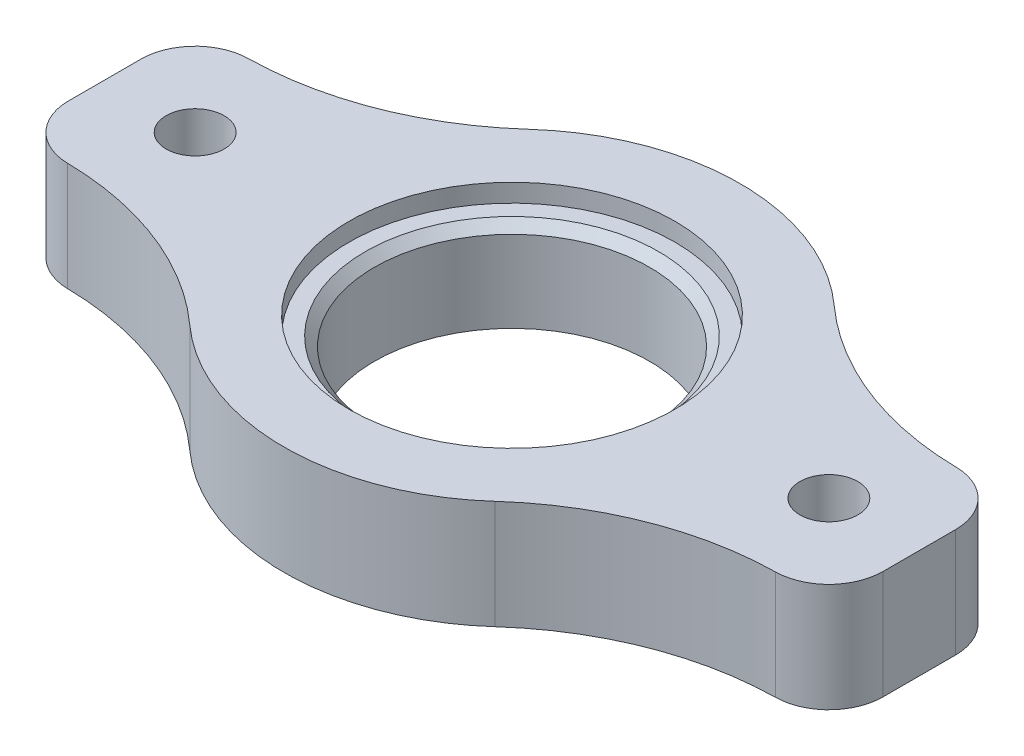
ISO-10303-21;
HEADER;
FILE_DESCRIPTION(('STEP AP214'),'2;1');
FILE_NAME('part.step','',(''),(''),'','','');
FILE_SCHEMA(('AUTOMOTIVE_DESIGN { 1 0 10303 214 1 1 1 1 }'));
ENDSEC;
DATA;
#1=APPLICATION_CONTEXT('core data for automotive mechanical design processes');
#2=APPLICATION_PROTOCOL_DEFINITION('international standard','automotive_design',2000,#1);
#3=PRODUCT_CONTEXT('',#1,'mechanical');
#4=PRODUCT('Part','Part','',(#3));
#5=PRODUCT_RELATED_PRODUCT_CATEGORY('part','',(#4));
#6=PRODUCT_DEFINITION_FORMATION('','',#4);
#7=PRODUCT_DEFINITION_CONTEXT('part definition',#1,'design');
#8=PRODUCT_DEFINITION('design','',#6,#7);
#9=PRODUCT_DEFINITION_SHAPE('','',#8);
#10=(LENGTH_UNIT() NAMED_UNIT(*) SI_UNIT(.MILLI.,.METRE.));
#11=(NAMED_UNIT(*) PLANE_ANGLE_UNIT() SI_UNIT($,.RADIAN.));
#12=(NAMED_UNIT(*) SI_UNIT($,.STERADIAN.) SOLID_ANGLE_UNIT());
#13=UNCERTAINTY_MEASURE_WITH_UNIT(LENGTH_MEASURE(1.E-05),#10,'distance_accuracy_value','');
#14=(GEOMETRIC_REPRESENTATION_CONTEXT(3) GLOBAL_UNCERTAINTY_ASSIGNED_CONTEXT((#13)) GLOBAL_UNIT_ASSIGNED_CONTEXT((#10,
#11,#12)) REPRESENTATION_CONTEXT('',''));
#15=CARTESIAN_POINT('',(0.,0.,0.));
#16=DIRECTION('',(0.,0.,1.));
#17=DIRECTION('',(1.,0.,0.));
#18=AXIS2_PLACEMENT_3D('',#15,#16,#17);
#19=CARTESIAN_POINT('',(0.,6.,0.));
#20=DIRECTION('',(0.,-1.,0.));
#21=DIRECTION('',(0.,0.,-1.));
#22=AXIS2_PLACEMENT_3D('',#19,#20,#21);
#23=CYLINDRICAL_SURFACE('',#22,7.6);
#24=CARTESIAN_POINT('',(0.,4.50000000000001,0.));
#25=DIRECTION('',(0.,1.,0.));
#26=DIRECTION('',(0.,0.,1.));
#27=AXIS2_PLACEMENT_3D('',#24,#25,#26);
#28=CIRCLE('',#27,7.6);
#29=CARTESIAN_POINT('',(0.,4.50000000000001,7.6));
#30=VERTEX_POINT('',#29);
#31=EDGE_CURVE('E51',#30,#30,#28,.T.);
#32=ORIENTED_EDGE('',*,*,#31,.T.);
#33=EDGE_LOOP('',(#32));
#34=FACE_BOUND('',#33,.T.);
#35=CARTESIAN_POINT('',(0.,0.,0.));
#36=DIRECTION('',(0.,1.,0.));
#37=DIRECTION('',(0.,0.,1.));
#38=AXIS2_PLACEMENT_3D('',#35,#36,#37);
#39=CIRCLE('',#38,7.6);
#40=CARTESIAN_POINT('',(0.,0.,7.6));
#41=VERTEX_POINT('',#40);
#42=EDGE_CURVE('E301',#41,#41,#39,.T.);
#43=ORIENTED_EDGE('',*,*,#42,.F.);
#44=EDGE_LOOP('',(#43));
#45=FACE_BOUND('',#44,.T.);
#46=ADVANCED_FACE('F42',(#34,#45),#23,.F.);
#47=CARTESIAN_POINT('',(0.,6.,0.));
#48=DIRECTION('',(0.,-1.,0.));
#49=DIRECTION('',(0.,0.,-1.));
#50=AXIS2_PLACEMENT_3D('',#47,#48,#49);
#51=CYLINDRICAL_SURFACE('',#50,12.6);
#52=CARTESIAN_POINT('',(0.,0.,0.));
#53=DIRECTION('',(0.,1.,0.));
#54=DIRECTION('',(0.,0.,1.));
#55=AXIS2_PLACEMENT_3D('',#52,#53,#54);
#56=CIRCLE('',#55,12.6);
#57=CARTESIAN_POINT('',(8.430772434659,0.,-9.3638707891018));
#58=VERTEX_POINT('',#57);
#59=CARTESIAN_POINT('',(-8.430772434659,0.,-9.3638707891018));
#60=VERTEX_POINT('',#59);
#61=EDGE_CURVE('E304',#58,#60,#56,.T.);
#62=ORIENTED_EDGE('',*,*,#61,.T.);
#63=DIRECTION('',(0.,-1.,0.));
#64=VECTOR('',#63,1.);
#65=CARTESIAN_POINT('',(-8.430772434659,6.,-9.3638707891018));
#66=LINE('',#65,#64);
#67=CARTESIAN_POINT('',(-8.430772434659,6.,-9.3638707891018));
#68=VERTEX_POINT('',#67);
#69=EDGE_CURVE('E188',#60,#68,#66,.F.);
#70=ORIENTED_EDGE('',*,*,#69,.T.);
#71=CARTESIAN_POINT('',(0.,6.,0.));
#72=DIRECTION('',(0.,1.,0.));
#73=DIRECTION('',(0.,0.,1.));
#74=AXIS2_PLACEMENT_3D('',#71,#72,#73);
#75=CIRCLE('',#74,12.6);
#76=CARTESIAN_POINT('',(8.430772434659,6.,-9.3638707891018));
#77=VERTEX_POINT('',#76);
#78=EDGE_CURVE('E282',#77,#68,#75,.T.);
#79=ORIENTED_EDGE('',*,*,#78,.F.);
#80=DIRECTION('',(0.,-1.,0.));
#81=VECTOR('',#80,1.);
#82=CARTESIAN_POINT('',(8.430772434659,6.,-9.3638707891018));
#83=LINE('',#82,#81);
#84=EDGE_CURVE('E185',#77,#58,#83,.T.);
#85=ORIENTED_EDGE('',*,*,#84,.T.);
#86=EDGE_LOOP('',(#62,#70,#79,#85));
#87=FACE_BOUND('',#86,.T.);
#88=ADVANCED_FACE('F231',(#87),#51,.T.);
#89=CARTESIAN_POINT('',(-22.5,6.,0.));
#90=DIRECTION('',(1.,0.,0.));
#91=DIRECTION('',(0.,0.,-1.));
#92=AXIS2_PLACEMENT_3D('',#89,#90,#91);
#93=PLANE('',#92);
#94=DIRECTION('',(0.,0.,1.));
#95=VECTOR('',#94,1.);
#96=CARTESIAN_POINT('',(-22.5,0.,0.));
#97=LINE('',#96,#95);
#98=CARTESIAN_POINT('',(-22.5,0.,-2.));
#99=VERTEX_POINT('',#98);
#100=CARTESIAN_POINT('',(-22.5,0.,2.));
#101=VERTEX_POINT('',#100);
#102=EDGE_CURVE('E307',#99,#101,#97,.T.);
#103=ORIENTED_EDGE('',*,*,#102,.T.);
#104=DIRECTION('',(0.,-1.,0.));
#105=VECTOR('',#104,1.);
#106=CARTESIAN_POINT('',(-22.5,6.,2.));
#107=LINE('',#106,#105);
#108=CARTESIAN_POINT('',(-22.5,6.,2.));
#109=VERTEX_POINT('',#108);
#110=EDGE_CURVE('E180',#101,#109,#107,.F.);
#111=ORIENTED_EDGE('',*,*,#110,.T.);
#112=DIRECTION('',(0.,0.,1.));
#113=VECTOR('',#112,1.);
#114=CARTESIAN_POINT('',(-22.5,6.,0.));
#115=LINE('',#114,#113);
#116=CARTESIAN_POINT('',(-22.5,6.,-2.));
#117=VERTEX_POINT('',#116);
#118=EDGE_CURVE('E286',#117,#109,#115,.T.);
#119=ORIENTED_EDGE('',*,*,#118,.F.);
#120=DIRECTION('',(0.,-1.,0.));
#121=VECTOR('',#120,1.);
#122=CARTESIAN_POINT('',(-22.5,0.,-2.));
#123=LINE('',#122,#121);
#124=EDGE_CURVE('E177',#117,#99,#123,.T.);
#125=ORIENTED_EDGE('',*,*,#124,.T.);
#126=EDGE_LOOP('',(#103,#111,#119,#125));
#127=FACE_BOUND('',#126,.T.);
#128=ADVANCED_FACE('F236',(#127),#93,.F.);
#129=CARTESIAN_POINT('',(0.,6.,0.));
#130=DIRECTION('',(0.,-1.,0.));
#131=DIRECTION('',(0.,0.,-1.));
#132=AXIS2_PLACEMENT_3D('',#129,#130,#131);
#133=CYLINDRICAL_SURFACE('',#132,12.6);
#134=CARTESIAN_POINT('',(0.,6.,0.));
#135=DIRECTION('',(0.,1.,0.));
#136=DIRECTION('',(0.,0.,1.));
#137=AXIS2_PLACEMENT_3D('',#134,#135,#136);
#138=CIRCLE('',#137,12.6);
#139=CARTESIAN_POINT('',(-8.430772434659,6.,9.3638707891018));
#140=VERTEX_POINT('',#139);
#141=CARTESIAN_POINT('',(8.430772434659,6.,9.3638707891018));
#142=VERTEX_POINT('',#141);
#143=EDGE_CURVE('E289',#140,#142,#138,.T.);
#144=ORIENTED_EDGE('',*,*,#143,.F.);
#145=DIRECTION('',(0.,-1.,0.));
#146=VECTOR('',#145,1.);
#147=CARTESIAN_POINT('',(-8.430772434659,6.,9.3638707891018));
#148=LINE('',#147,#146);
#149=CARTESIAN_POINT('',(-8.430772434659,0.,9.3638707891018));
#150=VERTEX_POINT('',#149);
#151=EDGE_CURVE('E192',#140,#150,#148,.T.);
#152=ORIENTED_EDGE('',*,*,#151,.T.);
#153=CARTESIAN_POINT('',(0.,0.,0.));
#154=DIRECTION('',(0.,1.,0.));
#155=DIRECTION('',(0.,0.,1.));
#156=AXIS2_PLACEMENT_3D('',#153,#154,#155);
#157=CIRCLE('',#156,12.6);
#158=CARTESIAN_POINT('',(8.430772434659,0.,9.3638707891018));
#159=VERTEX_POINT('',#158);
#160=EDGE_CURVE('E150',#150,#159,#157,.T.);
#161=ORIENTED_EDGE('',*,*,#160,.T.);
#162=DIRECTION('',(0.,-1.,0.));
#163=VECTOR('',#162,1.);
#164=CARTESIAN_POINT('',(8.430772434659,6.,9.3638707891018));
#165=LINE('',#164,#163);
#166=EDGE_CURVE('E190',#159,#142,#165,.F.);
#167=ORIENTED_EDGE('',*,*,#166,.T.);
#168=EDGE_LOOP('',(#144,#152,#161,#167));
#169=FACE_BOUND('',#168,.T.);
#170=ADVANCED_FACE('F326',(#169),#133,.T.);
#171=CARTESIAN_POINT('',(22.5,6.,0.));
#172=DIRECTION('',(1.,0.,0.));
#173=DIRECTION('',(0.,0.,-1.));
#174=AXIS2_PLACEMENT_3D('',#171,#172,#173);
#175=PLANE('',#174);
#176=DIRECTION('',(0.,0.,1.));
#177=VECTOR('',#176,1.);
#178=CARTESIAN_POINT('',(22.5,6.,0.));
#179=LINE('',#178,#177);
#180=CARTESIAN_POINT('',(22.5,6.,-2.));
#181=VERTEX_POINT('',#180);
#182=CARTESIAN_POINT('',(22.5,6.,2.));
#183=VERTEX_POINT('',#182);
#184=EDGE_CURVE('E297',#181,#183,#179,.T.);
#185=ORIENTED_EDGE('',*,*,#184,.T.);
#186=DIRECTION('',(0.,-1.,0.));
#187=VECTOR('',#186,1.);
#188=CARTESIAN_POINT('',(22.5,0.,2.));
#189=LINE('',#188,#187);
#190=CARTESIAN_POINT('',(22.5,0.,2.));
#191=VERTEX_POINT('',#190);
#192=EDGE_CURVE('E148',#183,#191,#189,.T.);
#193=ORIENTED_EDGE('',*,*,#192,.T.);
#194=DIRECTION('',(0.,0.,1.));
#195=VECTOR('',#194,1.);
#196=CARTESIAN_POINT('',(22.5,0.,0.));
#197=LINE('',#196,#195);
#198=CARTESIAN_POINT('',(22.5,0.,-2.));
#199=VERTEX_POINT('',#198);
#200=EDGE_CURVE('E136',#199,#191,#197,.T.);
#201=ORIENTED_EDGE('',*,*,#200,.F.);
#202=DIRECTION('',(0.,-1.,0.));
#203=VECTOR('',#202,1.);
#204=CARTESIAN_POINT('',(22.5,6.,-2.));
#205=LINE('',#204,#203);
#206=EDGE_CURVE('E145',#199,#181,#205,.F.);
#207=ORIENTED_EDGE('',*,*,#206,.T.);
#208=EDGE_LOOP('',(#185,#193,#201,#207));
#209=FACE_BOUND('',#208,.T.);
#210=ADVANCED_FACE('F144',(#209),#175,.T.);
#211=CARTESIAN_POINT('',(17.5,6.,0.));
#212=DIRECTION('',(0.,-1.,0.));
#213=DIRECTION('',(0.,0.,-1.));
#214=AXIS2_PLACEMENT_3D('',#211,#212,#213);
#215=CYLINDRICAL_SURFACE('',#214,1.6);
#216=CARTESIAN_POINT('',(17.5,6.,0.));
#217=DIRECTION('',(0.,1.,0.));
#218=DIRECTION('',(0.,0.,1.));
#219=AXIS2_PLACEMENT_3D('',#216,#217,#218);
#220=CIRCLE('',#219,1.6);
#221=CARTESIAN_POINT('',(17.5,6.,1.6));
#222=VERTEX_POINT('',#221);
#223=EDGE_CURVE('E159',#222,#222,#220,.T.);
#224=ORIENTED_EDGE('',*,*,#223,.T.);
#225=EDGE_LOOP('',(#224));
#226=FACE_BOUND('',#225,.T.);
#227=CARTESIAN_POINT('',(17.5,0.,0.));
#228=DIRECTION('',(0.,1.,0.));
#229=DIRECTION('',(0.,0.,1.));
#230=AXIS2_PLACEMENT_3D('',#227,#228,#229);
#231=CIRCLE('',#230,1.6);
#232=CARTESIAN_POINT('',(17.5,0.,1.6));
#233=VERTEX_POINT('',#232);
#234=EDGE_CURVE('E149',#233,#233,#231,.T.);
#235=ORIENTED_EDGE('',*,*,#234,.F.);
#236=EDGE_LOOP('',(#235));
#237=FACE_BOUND('',#236,.T.);
#238=ADVANCED_FACE('F315',(#226,#237),#215,.F.);
#239=CARTESIAN_POINT('',(-17.5,6.,0.));
#240=DIRECTION('',(0.,-1.,0.));
#241=DIRECTION('',(0.,0.,-1.));
#242=AXIS2_PLACEMENT_3D('',#239,#240,#241);
#243=CYLINDRICAL_SURFACE('',#242,1.6);
#244=CARTESIAN_POINT('',(-17.5,6.,0.));
#245=DIRECTION('',(0.,1.,0.));
#246=DIRECTION('',(0.,0.,1.));
#247=AXIS2_PLACEMENT_3D('',#244,#245,#246);
#248=CIRCLE('',#247,1.6);
#249=CARTESIAN_POINT('',(-17.5,6.,1.6));
#250=VERTEX_POINT('',#249);
#251=EDGE_CURVE('E154',#250,#250,#248,.T.);
#252=ORIENTED_EDGE('',*,*,#251,.T.);
#253=EDGE_LOOP('',(#252));
#254=FACE_BOUND('',#253,.T.);
#255=CARTESIAN_POINT('',(-17.5,0.,0.));
#256=DIRECTION('',(0.,1.,0.));
#257=DIRECTION('',(0.,0.,1.));
#258=AXIS2_PLACEMENT_3D('',#255,#256,#257);
#259=CIRCLE('',#258,1.6);
#260=CARTESIAN_POINT('',(-17.5,0.,1.6));
#261=VERTEX_POINT('',#260);
#262=EDGE_CURVE('E162',#261,#261,#259,.T.);
#263=ORIENTED_EDGE('',*,*,#262,.F.);
#264=EDGE_LOOP('',(#263));
#265=FACE_BOUND('',#264,.T.);
#266=ADVANCED_FACE('F317',(#254,#265),#243,.F.);
#267=CARTESIAN_POINT('',(0.,6.,0.));
#268=DIRECTION('',(0.,1.,0.));
#269=DIRECTION('',(0.,0.,1.));
#270=AXIS2_PLACEMENT_3D('',#267,#268,#269);
#271=PLANE('',#270);
#272=CARTESIAN_POINT('',(0.,6.,0.));
#273=DIRECTION('',(0.,1.,0.));
#274=DIRECTION('',(0.,0.,1.));
#275=AXIS2_PLACEMENT_3D('',#272,#273,#274);
#276=CIRCLE('',#275,9.);
#277=CARTESIAN_POINT('',(0.,6.,9.));
#278=VERTEX_POINT('',#277);
#279=EDGE_CURVE('E293',#278,#278,#276,.T.);
#280=ORIENTED_EDGE('',*,*,#279,.F.);
#281=EDGE_LOOP('',(#280));
#282=FACE_BOUND('',#281,.T.);
#283=ORIENTED_EDGE('',*,*,#143,.T.);
#284=CARTESIAN_POINT('',(19.8056241322148,6.,21.9976647109058));
#285=DIRECTION('',(0.,1.,0.));
#286=DIRECTION('',(0.,0.,1.));
#287=AXIS2_PLACEMENT_3D('',#284,#285,#286);
#288=CIRCLE('',#287,17.);
#289=CARTESIAN_POINT('',(19.5458436198322,6.,4.99964970663587));
#290=VERTEX_POINT('',#289);
#291=EDGE_CURVE('E211',#142,#290,#288,.F.);
#292=ORIENTED_EDGE('',*,*,#291,.T.);
#293=CARTESIAN_POINT('',(19.5,6.,2.));
#294=DIRECTION('',(0.,1.,0.));
#295=DIRECTION('',(0.,0.,1.));
#296=AXIS2_PLACEMENT_3D('',#293,#294,#295);
#297=CIRCLE('',#296,3.);
#298=EDGE_CURVE('E175',#290,#183,#297,.T.);
#299=ORIENTED_EDGE('',*,*,#298,.T.);
#300=ORIENTED_EDGE('',*,*,#184,.F.);
#301=CARTESIAN_POINT('',(19.5,6.,-2.));
#302=DIRECTION('',(0.,1.,0.));
#303=DIRECTION('',(0.,0.,1.));
#304=AXIS2_PLACEMENT_3D('',#301,#302,#303);
#305=CIRCLE('',#304,3.);
#306=CARTESIAN_POINT('',(19.5458436198322,6.,-4.99964970663587));
#307=VERTEX_POINT('',#306);
#308=EDGE_CURVE('E153',#181,#307,#305,.T.);
#309=ORIENTED_EDGE('',*,*,#308,.T.);
#310=CARTESIAN_POINT('',(19.8056241322148,6.,-21.9976647109058));
#311=DIRECTION('',(0.,1.,0.));
#312=DIRECTION('',(0.,0.,1.));
#313=AXIS2_PLACEMENT_3D('',#310,#311,#312);
#314=CIRCLE('',#313,17.);
#315=EDGE_CURVE('E214',#307,#77,#314,.F.);
#316=ORIENTED_EDGE('',*,*,#315,.T.);
#317=ORIENTED_EDGE('',*,*,#78,.T.);
#318=CARTESIAN_POINT('',(-19.8056241322148,6.,-21.9976647109058));
#319=DIRECTION('',(0.,1.,0.));
#320=DIRECTION('',(0.,0.,1.));
#321=AXIS2_PLACEMENT_3D('',#318,#319,#320);
#322=CIRCLE('',#321,17.);
#323=CARTESIAN_POINT('',(-19.5458436198322,6.,-4.99964970663587));
#324=VERTEX_POINT('',#323);
#325=EDGE_CURVE('E203',#68,#324,#322,.F.);
#326=ORIENTED_EDGE('',*,*,#325,.T.);
#327=CARTESIAN_POINT('',(-19.5,6.,-2.));
#328=DIRECTION('',(0.,1.,0.));
#329=DIRECTION('',(0.,0.,1.));
#330=AXIS2_PLACEMENT_3D('',#327,#328,#329);
#331=CIRCLE('',#330,3.);
#332=EDGE_CURVE('E169',#324,#117,#331,.T.);
#333=ORIENTED_EDGE('',*,*,#332,.T.);
#334=ORIENTED_EDGE('',*,*,#118,.T.);
#335=CARTESIAN_POINT('',(-19.5,6.,2.));
#336=DIRECTION('',(0.,1.,0.));
#337=DIRECTION('',(0.,0.,1.));
#338=AXIS2_PLACEMENT_3D('',#335,#336,#337);
#339=CIRCLE('',#338,3.);
#340=CARTESIAN_POINT('',(-19.5458436198322,6.,4.99964970663587));
#341=VERTEX_POINT('',#340);
#342=EDGE_CURVE('E171',#109,#341,#339,.T.);
#343=ORIENTED_EDGE('',*,*,#342,.T.);
#344=CARTESIAN_POINT('',(-19.8056241322148,6.,21.9976647109058));
#345=DIRECTION('',(0.,1.,0.));
#346=DIRECTION('',(0.,0.,1.));
#347=AXIS2_PLACEMENT_3D('',#344,#345,#346);
#348=CIRCLE('',#347,17.);
#349=EDGE_CURVE('E207',#341,#140,#348,.F.);
#350=ORIENTED_EDGE('',*,*,#349,.T.);
#351=EDGE_LOOP('',(#283,#292,#299,#300,#309,#316,#317,#326,#333,#334,#343,#350));
#352=FACE_BOUND('',#351,.T.);
#353=ORIENTED_EDGE('',*,*,#223,.F.);
#354=EDGE_LOOP('',(#353));
#355=FACE_BOUND('',#354,.T.);
#356=ORIENTED_EDGE('',*,*,#251,.F.);
#357=EDGE_LOOP('',(#356));
#358=FACE_BOUND('',#357,.T.);
#359=ADVANCED_FACE('F280',(#282,#352,#355,#358),#271,.T.);
#360=CARTESIAN_POINT('',(0.,0.,0.));
#361=DIRECTION('',(0.,1.,0.));
#362=DIRECTION('',(0.,0.,1.));
#363=AXIS2_PLACEMENT_3D('',#360,#361,#362);
#364=PLANE('',#363);
#365=ORIENTED_EDGE('',*,*,#42,.T.);
#366=EDGE_LOOP('',(#365));
#367=FACE_BOUND('',#366,.T.);
#368=ORIENTED_EDGE('',*,*,#200,.T.);
#369=CARTESIAN_POINT('',(19.5,0.,2.));
#370=DIRECTION('',(0.,1.,0.));
#371=DIRECTION('',(0.,0.,1.));
#372=AXIS2_PLACEMENT_3D('',#369,#370,#371);
#373=CIRCLE('',#372,3.);
#374=CARTESIAN_POINT('',(19.5458436198322,0.,4.99964970663587));
#375=VERTEX_POINT('',#374);
#376=EDGE_CURVE('E138',#191,#375,#373,.F.);
#377=ORIENTED_EDGE('',*,*,#376,.T.);
#378=CARTESIAN_POINT('',(19.8056241322148,0.,21.9976647109058));
#379=DIRECTION('',(0.,1.,0.));
#380=DIRECTION('',(0.,0.,1.));
#381=AXIS2_PLACEMENT_3D('',#378,#379,#380);
#382=CIRCLE('',#381,17.);
#383=EDGE_CURVE('E209',#375,#159,#382,.T.);
#384=ORIENTED_EDGE('',*,*,#383,.T.);
#385=ORIENTED_EDGE('',*,*,#160,.F.);
#386=CARTESIAN_POINT('',(-19.8056241322148,0.,21.9976647109058));
#387=DIRECTION('',(0.,1.,0.));
#388=DIRECTION('',(0.,0.,1.));
#389=AXIS2_PLACEMENT_3D('',#386,#387,#388);
#390=CIRCLE('',#389,17.);
#391=CARTESIAN_POINT('',(-19.5458436198322,0.,4.99964970663587));
#392=VERTEX_POINT('',#391);
#393=EDGE_CURVE('E205',#150,#392,#390,.T.);
#394=ORIENTED_EDGE('',*,*,#393,.T.);
#395=CARTESIAN_POINT('',(-19.5,0.,2.));
#396=DIRECTION('',(0.,1.,0.));
#397=DIRECTION('',(0.,0.,1.));
#398=AXIS2_PLACEMENT_3D('',#395,#396,#397);
#399=CIRCLE('',#398,3.);
#400=EDGE_CURVE('E139',#392,#101,#399,.F.);
#401=ORIENTED_EDGE('',*,*,#400,.T.);
#402=ORIENTED_EDGE('',*,*,#102,.F.);
#403=CARTESIAN_POINT('',(-19.5,0.,-2.));
#404=DIRECTION('',(0.,1.,0.));
#405=DIRECTION('',(0.,0.,1.));
#406=AXIS2_PLACEMENT_3D('',#403,#404,#405);
#407=CIRCLE('',#406,3.);
#408=CARTESIAN_POINT('',(-19.5458436198322,0.,-4.99964970663587));
#409=VERTEX_POINT('',#408);
#410=EDGE_CURVE('E156',#99,#409,#407,.F.);
#411=ORIENTED_EDGE('',*,*,#410,.T.);
#412=CARTESIAN_POINT('',(-19.8056241322148,0.,-21.9976647109058));
#413=DIRECTION('',(0.,1.,0.));
#414=DIRECTION('',(0.,0.,1.));
#415=AXIS2_PLACEMENT_3D('',#412,#413,#414);
#416=CIRCLE('',#415,17.);
#417=EDGE_CURVE('E201',#409,#60,#416,.T.);
#418=ORIENTED_EDGE('',*,*,#417,.T.);
#419=ORIENTED_EDGE('',*,*,#61,.F.);
#420=CARTESIAN_POINT('',(19.8056241322148,0.,-21.9976647109058));
#421=DIRECTION('',(0.,1.,0.));
#422=DIRECTION('',(0.,0.,1.));
#423=AXIS2_PLACEMENT_3D('',#420,#421,#422);
#424=CIRCLE('',#423,17.);
#425=CARTESIAN_POINT('',(19.5458436198322,0.,-4.99964970663587));
#426=VERTEX_POINT('',#425);
#427=EDGE_CURVE('E58',#58,#426,#424,.T.);
#428=ORIENTED_EDGE('',*,*,#427,.T.);
#429=CARTESIAN_POINT('',(19.5,0.,-2.));
#430=DIRECTION('',(0.,1.,0.));
#431=DIRECTION('',(0.,0.,1.));
#432=AXIS2_PLACEMENT_3D('',#429,#430,#431);
#433=CIRCLE('',#432,3.);
#434=EDGE_CURVE('E131',#426,#199,#433,.F.);
#435=ORIENTED_EDGE('',*,*,#434,.T.);
#436=EDGE_LOOP('',(#368,#377,#384,#385,#394,#401,#402,#411,#418,#419,#428,#435));
#437=FACE_BOUND('',#436,.T.);
#438=ORIENTED_EDGE('',*,*,#234,.T.);
#439=EDGE_LOOP('',(#438));
#440=FACE_BOUND('',#439,.T.);
#441=ORIENTED_EDGE('',*,*,#262,.T.);
#442=EDGE_LOOP('',(#441));
#443=FACE_BOUND('',#442,.T.);
#444=ADVANCED_FACE('F133',(#367,#437,#440,#443),#364,.F.);
#445=CARTESIAN_POINT('',(19.5,6.,2.));
#446=DIRECTION('',(0.,1.,0.));
#447=DIRECTION('',(0.,0.,1.));
#448=AXIS2_PLACEMENT_3D('',#445,#446,#447);
#449=CYLINDRICAL_SURFACE('',#448,3.);
#450=ORIENTED_EDGE('',*,*,#298,.F.);
#451=DIRECTION('',(0.,1.,0.));
#452=VECTOR('',#451,1.);
#453=CARTESIAN_POINT('',(19.5458436198322,6.,4.99964970663587));
#454=LINE('',#453,#452);
#455=EDGE_CURVE('E197',#290,#375,#454,.F.);
#456=ORIENTED_EDGE('',*,*,#455,.T.);
#457=ORIENTED_EDGE('',*,*,#376,.F.);
#458=ORIENTED_EDGE('',*,*,#192,.F.);
#459=EDGE_LOOP('',(#450,#456,#457,#458));
#460=FACE_BOUND('',#459,.T.);
#461=ADVANCED_FACE('F241',(#460),#449,.T.);
#462=CARTESIAN_POINT('',(19.5,6.,-2.));
#463=DIRECTION('',(0.,-1.,0.));
#464=DIRECTION('',(0.,0.,-1.));
#465=AXIS2_PLACEMENT_3D('',#462,#463,#464);
#466=CYLINDRICAL_SURFACE('',#465,3.);
#467=ORIENTED_EDGE('',*,*,#434,.F.);
#468=DIRECTION('',(0.,-1.,0.));
#469=VECTOR('',#468,1.);
#470=CARTESIAN_POINT('',(19.5458436198322,6.,-4.99964970663587));
#471=LINE('',#470,#469);
#472=EDGE_CURVE('E65',#426,#307,#471,.F.);
#473=ORIENTED_EDGE('',*,*,#472,.T.);
#474=ORIENTED_EDGE('',*,*,#308,.F.);
#475=ORIENTED_EDGE('',*,*,#206,.F.);
#476=EDGE_LOOP('',(#467,#473,#474,#475));
#477=FACE_BOUND('',#476,.T.);
#478=ADVANCED_FACE('F152',(#477),#466,.T.);
#479=CARTESIAN_POINT('',(-19.5,6.,2.));
#480=DIRECTION('',(0.,-1.,0.));
#481=DIRECTION('',(0.,0.,-1.));
#482=AXIS2_PLACEMENT_3D('',#479,#480,#481);
#483=CYLINDRICAL_SURFACE('',#482,3.);
#484=ORIENTED_EDGE('',*,*,#400,.F.);
#485=DIRECTION('',(0.,-1.,0.));
#486=VECTOR('',#485,1.);
#487=CARTESIAN_POINT('',(-19.5458436198322,6.,4.99964970663587));
#488=LINE('',#487,#486);
#489=EDGE_CURVE('E195',#392,#341,#488,.F.);
#490=ORIENTED_EDGE('',*,*,#489,.T.);
#491=ORIENTED_EDGE('',*,*,#342,.F.);
#492=ORIENTED_EDGE('',*,*,#110,.F.);
#493=EDGE_LOOP('',(#484,#490,#491,#492));
#494=FACE_BOUND('',#493,.T.);
#495=ADVANCED_FACE('F247',(#494),#483,.T.);
#496=CARTESIAN_POINT('',(-19.5,6.,-2.));
#497=DIRECTION('',(0.,1.,0.));
#498=DIRECTION('',(0.,0.,1.));
#499=AXIS2_PLACEMENT_3D('',#496,#497,#498);
#500=CYLINDRICAL_SURFACE('',#499,3.);
#501=ORIENTED_EDGE('',*,*,#332,.F.);
#502=DIRECTION('',(0.,1.,0.));
#503=VECTOR('',#502,1.);
#504=CARTESIAN_POINT('',(-19.5458436198322,6.,-4.99964970663587));
#505=LINE('',#504,#503);
#506=EDGE_CURVE('E182',#324,#409,#505,.F.);
#507=ORIENTED_EDGE('',*,*,#506,.T.);
#508=ORIENTED_EDGE('',*,*,#410,.F.);
#509=ORIENTED_EDGE('',*,*,#124,.F.);
#510=EDGE_LOOP('',(#501,#507,#508,#509));
#511=FACE_BOUND('',#510,.T.);
#512=ADVANCED_FACE('F250',(#511),#500,.T.);
#513=CARTESIAN_POINT('',(-19.8056241322148,6.,-21.9976647109058));
#514=DIRECTION('',(0.,1.,0.));
#515=DIRECTION('',(0.,0.,1.));
#516=AXIS2_PLACEMENT_3D('',#513,#514,#515);
#517=CYLINDRICAL_SURFACE('',#516,17.);
#518=ORIENTED_EDGE('',*,*,#325,.F.);
#519=ORIENTED_EDGE('',*,*,#69,.F.);
#520=ORIENTED_EDGE('',*,*,#417,.F.);
#521=ORIENTED_EDGE('',*,*,#506,.F.);
#522=EDGE_LOOP('',(#518,#519,#520,#521));
#523=FACE_BOUND('',#522,.T.);
#524=ADVANCED_FACE('F254',(#523),#517,.F.);
#525=CARTESIAN_POINT('',(-19.8056241322148,6.,21.9976647109058));
#526=DIRECTION('',(0.,1.,0.));
#527=DIRECTION('',(0.,0.,1.));
#528=AXIS2_PLACEMENT_3D('',#525,#526,#527);
#529=CYLINDRICAL_SURFACE('',#528,17.);
#530=ORIENTED_EDGE('',*,*,#349,.F.);
#531=ORIENTED_EDGE('',*,*,#489,.F.);
#532=ORIENTED_EDGE('',*,*,#393,.F.);
#533=ORIENTED_EDGE('',*,*,#151,.F.);
#534=EDGE_LOOP('',(#530,#531,#532,#533));
#535=FACE_BOUND('',#534,.T.);
#536=ADVANCED_FACE('F258',(#535),#529,.F.);
#537=CARTESIAN_POINT('',(19.8056241322148,6.,21.9976647109058));
#538=DIRECTION('',(0.,1.,0.));
#539=DIRECTION('',(0.,0.,1.));
#540=AXIS2_PLACEMENT_3D('',#537,#538,#539);
#541=CYLINDRICAL_SURFACE('',#540,17.);
#542=ORIENTED_EDGE('',*,*,#291,.F.);
#543=ORIENTED_EDGE('',*,*,#166,.F.);
#544=ORIENTED_EDGE('',*,*,#383,.F.);
#545=ORIENTED_EDGE('',*,*,#455,.F.);
#546=EDGE_LOOP('',(#542,#543,#544,#545));
#547=FACE_BOUND('',#546,.T.);
#548=ADVANCED_FACE('F262',(#547),#541,.F.);
#549=CARTESIAN_POINT('',(19.8056241322148,6.,-21.9976647109058));
#550=DIRECTION('',(0.,1.,0.));
#551=DIRECTION('',(0.,0.,1.));
#552=AXIS2_PLACEMENT_3D('',#549,#550,#551);
#553=CYLINDRICAL_SURFACE('',#552,17.);
#554=ORIENTED_EDGE('',*,*,#315,.F.);
#555=ORIENTED_EDGE('',*,*,#472,.F.);
#556=ORIENTED_EDGE('',*,*,#427,.F.);
#557=ORIENTED_EDGE('',*,*,#84,.F.);
#558=EDGE_LOOP('',(#554,#555,#556,#557));
#559=FACE_BOUND('',#558,.T.);
#560=ADVANCED_FACE('F265',(#559),#553,.F.);
#561=CARTESIAN_POINT('',(0.,5.,0.));
#562=DIRECTION('',(0.,1.,0.));
#563=DIRECTION('',(0.,0.,1.));
#564=AXIS2_PLACEMENT_3D('',#561,#562,#563);
#565=CYLINDRICAL_SURFACE('',#564,9.);
#566=CARTESIAN_POINT('',(0.,5.,0.));
#567=DIRECTION('',(0.,1.,0.));
#568=DIRECTION('',(0.,0.,1.));
#569=AXIS2_PLACEMENT_3D('',#566,#567,#568);
#570=CIRCLE('',#569,9.);
#571=CARTESIAN_POINT('',(0.,5.,9.));
#572=VERTEX_POINT('',#571);
#573=EDGE_CURVE('E305',#572,#572,#570,.T.);
#574=ORIENTED_EDGE('',*,*,#573,.F.);
#575=EDGE_LOOP('',(#574));
#576=FACE_BOUND('',#575,.T.);
#577=ORIENTED_EDGE('',*,*,#279,.T.);
#578=EDGE_LOOP('',(#577));
#579=FACE_BOUND('',#578,.T.);
#580=ADVANCED_FACE('F226',(#576,#579),#565,.F.);
#581=CARTESIAN_POINT('',(0.,5.,0.));
#582=DIRECTION('',(0.,1.,0.));
#583=DIRECTION('',(0.,0.,1.));
#584=AXIS2_PLACEMENT_3D('',#581,#582,#583);
#585=PLANE('',#584);
#586=CARTESIAN_POINT('',(0.,5.,0.));
#587=DIRECTION('',(0.,1.,0.));
#588=DIRECTION('',(0.,0.,1.));
#589=AXIS2_PLACEMENT_3D('',#586,#587,#588);
#590=CIRCLE('',#589,8.1);
#591=CARTESIAN_POINT('',(0.,5.,8.1));
#592=VERTEX_POINT('',#591);
#593=EDGE_CURVE('E11',#592,#592,#590,.F.);
#594=ORIENTED_EDGE('',*,*,#593,.T.);
#595=EDGE_LOOP('',(#594));
#596=FACE_BOUND('',#595,.T.);
#597=ORIENTED_EDGE('',*,*,#573,.T.);
#598=EDGE_LOOP('',(#597));
#599=FACE_BOUND('',#598,.T.);
#600=ADVANCED_FACE('F221',(#596,#599),#585,.T.);
#601=CARTESIAN_POINT('',(0.,4.50000000000001,0.));
#602=DIRECTION('',(0.,1.,0.));
#603=DIRECTION('',(0.,0.,1.));
#604=AXIS2_PLACEMENT_3D('',#601,#602,#603);
#605=CONICAL_SURFACE('',#604,7.6,0.785398163397457);
#606=ORIENTED_EDGE('',*,*,#593,.F.);
#607=EDGE_LOOP('',(#606));
#608=FACE_BOUND('',#607,.T.);
#609=ORIENTED_EDGE('',*,*,#31,.F.);
#610=EDGE_LOOP('',(#609));
#611=FACE_BOUND('',#610,.T.);
#612=ADVANCED_FACE('F45',(#608,#611),#605,.F.);
#613=CLOSED_SHELL('',(#46,#88,#128,#170,#210,#238,#266,#359,#444,#461,#478,#495,#512,#524,#536,
#548,#560,#580,#600,#612));
#614=MANIFOLD_SOLID_BREP('B2',#613);
#615=ADVANCED_BREP_SHAPE_REPRESENTATION('',(#18,#614),#14);
#616=SHAPE_DEFINITION_REPRESENTATION(#9,#615);
ENDSEC;
END-ISO-10303-21;
